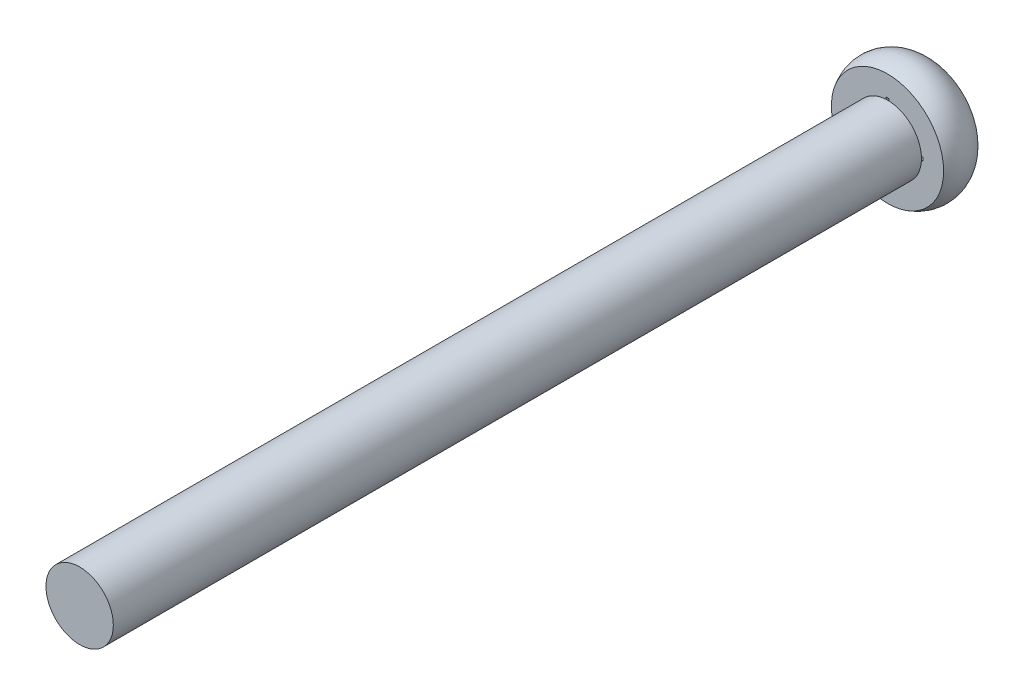
ISO-10303-21;
HEADER;
FILE_DESCRIPTION(('STEP AP214'),'2;1');
FILE_NAME('part.step','',(''),(''),'','','');
FILE_SCHEMA(('AUTOMOTIVE_DESIGN { 1 0 10303 214 1 1 1 1 }'));
ENDSEC;
DATA;
#1=APPLICATION_CONTEXT('core data for automotive mechanical design processes');
#2=APPLICATION_PROTOCOL_DEFINITION('international standard','automotive_design',2000,#1);
#3=PRODUCT_CONTEXT('',#1,'mechanical');
#4=PRODUCT('Part','Part','',(#3));
#5=PRODUCT_RELATED_PRODUCT_CATEGORY('part','',(#4));
#6=PRODUCT_DEFINITION_FORMATION('','',#4);
#7=PRODUCT_DEFINITION_CONTEXT('part definition',#1,'design');
#8=PRODUCT_DEFINITION('design','',#6,#7);
#9=PRODUCT_DEFINITION_SHAPE('','',#8);
#10=(LENGTH_UNIT() NAMED_UNIT(*) SI_UNIT(.MILLI.,.METRE.));
#11=(NAMED_UNIT(*) PLANE_ANGLE_UNIT() SI_UNIT($,.RADIAN.));
#12=(NAMED_UNIT(*) SI_UNIT($,.STERADIAN.) SOLID_ANGLE_UNIT());
#13=UNCERTAINTY_MEASURE_WITH_UNIT(LENGTH_MEASURE(1.E-05),#10,'distance_accuracy_value','');
#14=(GEOMETRIC_REPRESENTATION_CONTEXT(3) GLOBAL_UNCERTAINTY_ASSIGNED_CONTEXT((#13)) GLOBAL_UNIT_ASSIGNED_CONTEXT((#10,
#11,#12)) REPRESENTATION_CONTEXT('',''));
#15=CARTESIAN_POINT('',(0.,0.,0.));
#16=DIRECTION('',(0.,0.,1.));
#17=DIRECTION('',(1.,0.,0.));
#18=AXIS2_PLACEMENT_3D('',#15,#16,#17);
#19=CARTESIAN_POINT('',(0.,0.,-2.));
#20=DIRECTION('',(0.,0.,-1.));
#21=DIRECTION('',(-1.,0.,0.));
#22=AXIS2_PLACEMENT_3D('',#19,#20,#21);
#23=PLANE('',#22);
#24=DIRECTION('',(0.,-1.,0.));
#25=VECTOR('',#24,1.);
#26=CARTESIAN_POINT('',(0.5,-0.5,-2.));
#27=LINE('',#26,#25);
#28=CARTESIAN_POINT('',(0.5,-0.5,-2.));
#29=VERTEX_POINT('',#28);
#30=CARTESIAN_POINT('',(0.5,-1.72737700560521,-2.));
#31=VERTEX_POINT('',#30);
#32=EDGE_CURVE('E297',#29,#31,#27,.T.);
#33=ORIENTED_EDGE('',*,*,#32,.F.);
#34=DIRECTION('',(-1.,0.,0.));
#35=VECTOR('',#34,1.);
#36=CARTESIAN_POINT('',(2.,-0.5,-2.));
#37=LINE('',#36,#35);
#38=CARTESIAN_POINT('',(1.72737700560521,-0.5,-2.));
#39=VERTEX_POINT('',#38);
#40=EDGE_CURVE('E295',#39,#29,#37,.T.);
#41=ORIENTED_EDGE('',*,*,#40,.F.);
#42=CARTESIAN_POINT('',(0.,0.,-2.));
#43=DIRECTION('',(0.,0.,1.));
#44=DIRECTION('',(1.,0.,0.));
#45=AXIS2_PLACEMENT_3D('',#42,#43,#44);
#46=CIRCLE('',#45,1.79828566126008);
#47=EDGE_CURVE('E365',#31,#39,#46,.T.);
#48=ORIENTED_EDGE('',*,*,#47,.F.);
#49=EDGE_LOOP('',(#33,#41,#48));
#50=FACE_BOUND('',#49,.T.);
#51=ADVANCED_FACE('F35',(#50),#23,.T.);
#52=DIRECTION('',(1.,0.,0.));
#53=VECTOR('',#52,1.);
#54=CARTESIAN_POINT('',(2.,0.5,-2.));
#55=LINE('',#54,#53);
#56=CARTESIAN_POINT('',(0.5,0.5,-2.));
#57=VERTEX_POINT('',#56);
#58=CARTESIAN_POINT('',(1.72737700560521,0.5,-2.));
#59=VERTEX_POINT('',#58);
#60=EDGE_CURVE('E288',#57,#59,#55,.T.);
#61=ORIENTED_EDGE('',*,*,#60,.F.);
#62=DIRECTION('',(0.,-1.,0.));
#63=VECTOR('',#62,1.);
#64=CARTESIAN_POINT('',(0.5,2.,-2.));
#65=LINE('',#64,#63);
#66=CARTESIAN_POINT('',(0.5,1.72737700560521,-2.));
#67=VERTEX_POINT('',#66);
#68=EDGE_CURVE('E286',#67,#57,#65,.T.);
#69=ORIENTED_EDGE('',*,*,#68,.F.);
#70=EDGE_CURVE('E366',#59,#67,#46,.T.);
#71=ORIENTED_EDGE('',*,*,#70,.F.);
#72=EDGE_LOOP('',(#61,#69,#71));
#73=FACE_BOUND('',#72,.T.);
#74=ADVANCED_FACE('F259',(#73),#23,.T.);
#75=DIRECTION('',(0.,1.,0.));
#76=VECTOR('',#75,1.);
#77=CARTESIAN_POINT('',(-0.5,2.,-2.));
#78=LINE('',#77,#76);
#79=CARTESIAN_POINT('',(-0.5,0.5,-2.));
#80=VERTEX_POINT('',#79);
#81=CARTESIAN_POINT('',(-0.5,1.72737700560521,-2.));
#82=VERTEX_POINT('',#81);
#83=EDGE_CURVE('E279',#80,#82,#78,.T.);
#84=ORIENTED_EDGE('',*,*,#83,.F.);
#85=DIRECTION('',(1.,0.,0.));
#86=VECTOR('',#85,1.);
#87=CARTESIAN_POINT('',(-0.5,0.5,-2.));
#88=LINE('',#87,#86);
#89=CARTESIAN_POINT('',(-1.7273770056052,0.5,-2.));
#90=VERTEX_POINT('',#89);
#91=EDGE_CURVE('E280',#90,#80,#88,.T.);
#92=ORIENTED_EDGE('',*,*,#91,.F.);
#93=EDGE_CURVE('E282',#82,#90,#46,.T.);
#94=ORIENTED_EDGE('',*,*,#93,.F.);
#95=EDGE_LOOP('',(#84,#92,#94));
#96=FACE_BOUND('',#95,.T.);
#97=ADVANCED_FACE('F264',(#96),#23,.T.);
#98=CARTESIAN_POINT('',(0.,0.,0.));
#99=DIRECTION('',(0.,0.,1.));
#100=DIRECTION('',(1.,0.,0.));
#101=AXIS2_PLACEMENT_3D('',#98,#99,#100);
#102=PLANE('',#101);
#103=CARTESIAN_POINT('',(0.0135896024399493,-0.0135896024399496,0.));
#104=DIRECTION('',(0.,0.,1.));
#105=DIRECTION('',(1.,0.,0.));
#106=AXIS2_PLACEMENT_3D('',#103,#104,#105);
#107=CIRCLE('',#106,1.5);
#108=CARTESIAN_POINT('',(1.51097796644111,0.074886876659955,0.));
#109=VERTEX_POINT('',#108);
#110=CARTESIAN_POINT('',(0.0748868766599548,1.48515742230212,0.));
#111=VERTEX_POINT('',#110);
#112=EDGE_CURVE('E65',#109,#111,#107,.T.);
#113=ORIENTED_EDGE('',*,*,#112,.F.);
#114=DIRECTION('',(1.,0.,0.));
#115=VECTOR('',#114,1.);
#116=CARTESIAN_POINT('',(0.,0.074886876659955,0.));
#117=LINE('',#116,#115);
#118=CARTESIAN_POINT('',(1.57488687665996,0.0748868766599549,0.));
#119=VERTEX_POINT('',#118);
#120=EDGE_CURVE('E185',#109,#119,#117,.T.);
#121=ORIENTED_EDGE('',*,*,#120,.T.);
#122=DIRECTION('',(0.,-1.,0.));
#123=VECTOR('',#122,1.);
#124=CARTESIAN_POINT('',(1.57488687665995,0.,0.));
#125=LINE('',#124,#123);
#126=CARTESIAN_POINT('',(1.57488687665996,-0.074886876659955,0.));
#127=VERTEX_POINT('',#126);
#128=EDGE_CURVE('E344',#119,#127,#125,.T.);
#129=ORIENTED_EDGE('',*,*,#128,.T.);
#130=DIRECTION('',(-1.,0.,0.));
#131=VECTOR('',#130,1.);
#132=CARTESIAN_POINT('',(0.,-0.0748868766599549,0.));
#133=LINE('',#132,#131);
#134=CARTESIAN_POINT('',(1.51233662718202,-0.0748868766599549,0.));
#135=VERTEX_POINT('',#134);
#136=EDGE_CURVE('E341',#127,#135,#133,.T.);
#137=ORIENTED_EDGE('',*,*,#136,.T.);
#138=CARTESIAN_POINT('',(0.0748868766599548,-1.51233662718202,0.));
#139=VERTEX_POINT('',#138);
#140=EDGE_CURVE('E58',#139,#135,#107,.T.);
#141=ORIENTED_EDGE('',*,*,#140,.F.);
#142=DIRECTION('',(0.,-1.,0.));
#143=VECTOR('',#142,1.);
#144=CARTESIAN_POINT('',(0.0748868766599551,0.,0.));
#145=LINE('',#144,#143);
#146=CARTESIAN_POINT('',(0.0748868766599548,-1.57488687665996,0.));
#147=VERTEX_POINT('',#146);
#148=EDGE_CURVE('E340',#139,#147,#145,.T.);
#149=ORIENTED_EDGE('',*,*,#148,.T.);
#150=DIRECTION('',(-1.,0.,0.));
#151=VECTOR('',#150,1.);
#152=CARTESIAN_POINT('',(0.,-1.57488687665995,0.));
#153=LINE('',#152,#151);
#154=CARTESIAN_POINT('',(-0.0748868766599552,-1.57488687665996,0.));
#155=VERTEX_POINT('',#154);
#156=EDGE_CURVE('E308',#147,#155,#153,.T.);
#157=ORIENTED_EDGE('',*,*,#156,.T.);
#158=DIRECTION('',(0.,1.,0.));
#159=VECTOR('',#158,1.);
#160=CARTESIAN_POINT('',(-0.0748868766599548,0.,0.));
#161=LINE('',#160,#159);
#162=CARTESIAN_POINT('',(-0.074886876659955,-1.51097796644111,0.));
#163=VERTEX_POINT('',#162);
#164=EDGE_CURVE('E332',#155,#163,#161,.T.);
#165=ORIENTED_EDGE('',*,*,#164,.T.);
#166=CARTESIAN_POINT('',(-1.48515742230212,-0.0748868766599549,0.));
#167=VERTEX_POINT('',#166);
#168=EDGE_CURVE('E49',#167,#163,#107,.T.);
#169=ORIENTED_EDGE('',*,*,#168,.F.);
#170=DIRECTION('',(-1.,0.,0.));
#171=VECTOR('',#170,1.);
#172=CARTESIAN_POINT('',(0.,-0.0748868766599549,0.));
#173=LINE('',#172,#171);
#174=CARTESIAN_POINT('',(-1.57488687665995,-0.0748868766599549,0.));
#175=VERTEX_POINT('',#174);
#176=EDGE_CURVE('E334',#167,#175,#173,.T.);
#177=ORIENTED_EDGE('',*,*,#176,.T.);
#178=DIRECTION('',(0.,1.,0.));
#179=VECTOR('',#178,1.);
#180=CARTESIAN_POINT('',(-1.57488687665995,0.,0.));
#181=LINE('',#180,#179);
#182=CARTESIAN_POINT('',(-1.57488687665996,0.074886876659955,0.));
#183=VERTEX_POINT('',#182);
#184=EDGE_CURVE('E355',#175,#183,#181,.T.);
#185=ORIENTED_EDGE('',*,*,#184,.T.);
#186=DIRECTION('',(1.,0.,0.));
#187=VECTOR('',#186,1.);
#188=CARTESIAN_POINT('',(0.,0.0748868766599549,0.));
#189=LINE('',#188,#187);
#190=CARTESIAN_POINT('',(-1.48379876156122,0.0748868766599549,0.));
#191=VERTEX_POINT('',#190);
#192=EDGE_CURVE('E352',#183,#191,#189,.T.);
#193=ORIENTED_EDGE('',*,*,#192,.T.);
#194=CARTESIAN_POINT('',(-0.0748868766599547,1.48379876156122,0.));
#195=VERTEX_POINT('',#194);
#196=EDGE_CURVE('E11',#195,#191,#107,.T.);
#197=ORIENTED_EDGE('',*,*,#196,.F.);
#198=DIRECTION('',(0.,1.,0.));
#199=VECTOR('',#198,1.);
#200=CARTESIAN_POINT('',(-0.0748868766599548,0.,0.));
#201=LINE('',#200,#199);
#202=CARTESIAN_POINT('',(-0.0748868766599548,1.57488687665996,0.));
#203=VERTEX_POINT('',#202);
#204=EDGE_CURVE('E351',#195,#203,#201,.T.);
#205=ORIENTED_EDGE('',*,*,#204,.T.);
#206=DIRECTION('',(1.,0.,0.));
#207=VECTOR('',#206,1.);
#208=CARTESIAN_POINT('',(0.,1.57488687665995,0.));
#209=LINE('',#208,#207);
#210=CARTESIAN_POINT('',(0.0748868766599549,1.57488687665996,0.));
#211=VERTEX_POINT('',#210);
#212=EDGE_CURVE('E182',#203,#211,#209,.T.);
#213=ORIENTED_EDGE('',*,*,#212,.T.);
#214=DIRECTION('',(0.,-1.,0.));
#215=VECTOR('',#214,1.);
#216=CARTESIAN_POINT('',(0.0748868766599546,0.,0.));
#217=LINE('',#216,#215);
#218=EDGE_CURVE('E178',#211,#111,#217,.T.);
#219=ORIENTED_EDGE('',*,*,#218,.T.);
#220=EDGE_LOOP('',(#113,#121,#129,#137,#141,#149,#157,#165,#169,#177,#185,#193,#197,#205,#213,#219));
#221=FACE_BOUND('',#220,.T.);
#222=CARTESIAN_POINT('',(0.,0.,0.));
#223=DIRECTION('',(0.,0.,1.));
#224=DIRECTION('',(1.,0.,0.));
#225=AXIS2_PLACEMENT_3D('',#222,#223,#224);
#226=CIRCLE('',#225,2.5);
#227=CARTESIAN_POINT('',(2.5,0.,0.));
#228=VERTEX_POINT('',#227);
#229=EDGE_CURVE('E302',#228,#228,#226,.T.);
#230=ORIENTED_EDGE('',*,*,#229,.T.);
#231=EDGE_LOOP('',(#230));
#232=FACE_BOUND('',#231,.T.);
#233=ADVANCED_FACE('F37',(#221,#232),#102,.T.);
#234=DIRECTION('',(0.,1.,0.));
#235=VECTOR('',#234,1.);
#236=CARTESIAN_POINT('',(-0.5,-0.5,-2.));
#237=LINE('',#236,#235);
#238=CARTESIAN_POINT('',(-0.5,-1.72737700560521,-2.));
#239=VERTEX_POINT('',#238);
#240=CARTESIAN_POINT('',(-0.5,-0.5,-2.));
#241=VERTEX_POINT('',#240);
#242=EDGE_CURVE('E211',#239,#241,#237,.T.);
#243=ORIENTED_EDGE('',*,*,#242,.F.);
#244=CARTESIAN_POINT('',(-1.7273770056052,-0.5,-2.));
#245=VERTEX_POINT('',#244);
#246=EDGE_CURVE('E465',#245,#239,#46,.T.);
#247=ORIENTED_EDGE('',*,*,#246,.F.);
#248=DIRECTION('',(-1.,0.,0.));
#249=VECTOR('',#248,1.);
#250=CARTESIAN_POINT('',(-0.5,-0.5,-2.));
#251=LINE('',#250,#249);
#252=EDGE_CURVE('E290',#241,#245,#251,.T.);
#253=ORIENTED_EDGE('',*,*,#252,.F.);
#254=EDGE_LOOP('',(#243,#247,#253));
#255=FACE_BOUND('',#254,.T.);
#256=ADVANCED_FACE('F254',(#255),#23,.T.);
#257=CARTESIAN_POINT('',(0.,0.,-1.5));
#258=DIRECTION('',(0.,0.,1.));
#259=DIRECTION('',(1.,0.,0.));
#260=AXIS2_PLACEMENT_3D('',#257,#258,#259);
#261=TOROIDAL_SURFACE('',#260,1.79828566126008,0.5);
#262=CARTESIAN_POINT('',(-0.484531485230559,-2.00019999999807,-1.92722635966677));
#263=CARTESIAN_POINT('',(-0.487730741656916,-1.97399509292181,-1.94227767777816));
#264=CARTESIAN_POINT('',(-0.490465318957066,-1.94648320162751,-1.95514285248114));
#265=CARTESIAN_POINT('',(-0.494944021195538,-1.88965509794122,-1.97621348988364));
#266=CARTESIAN_POINT('',(-0.49668820162521,-1.86033898674063,-1.98441921364944));
#267=CARTESIAN_POINT('',(-0.499126116457835,-1.80069115496455,-1.99588870117535));
#268=CARTESIAN_POINT('',(-0.499819222481771,-1.7703588379215,-1.99914950864462));
#269=CARTESIAN_POINT('',(-0.500118732977777,-1.70955778735153,-2.00055859474223));
#270=CARTESIAN_POINT('',(-0.499724916277443,-1.67908902731998,-1.99870583283623));
#271=CARTESIAN_POINT('',(-0.497853789650744,-1.61942291189497,-1.98990287416961));
#272=CARTESIAN_POINT('',(-0.496393740016551,-1.59021306252827,-1.98303388069926));
#273=CARTESIAN_POINT('',(-0.492425751368406,-1.53353662294232,-1.96436596183112));
#274=CARTESIAN_POINT('',(-0.489920279158611,-1.50606610316026,-1.95257864183446));
#275=CARTESIAN_POINT('',(-0.485522319982868,-1.46775366051375,-1.931887870676));
#276=CARTESIAN_POINT('',(-0.48401623101767,-1.45586102614728,-1.92480227918278));
#277=CARTESIAN_POINT('',(-0.482405797596021,-1.44431196382551,-1.91722578561798));
#278=B_SPLINE_CURVE_WITH_KNOTS('',3,(#262,#263,#264,#265,#266,#267,#268,#269,#270,#271,#272,
#273,#274,#275,#276,#277),.UNSPECIFIED.,.F.,.F.,(4,2,2,2,2,2,2,4),(0.,0.0910547846834963,
0.182104467117809,0.273208561671024,0.364331195901967,0.454010535018956,0.54347945069811,
0.58520313275069),.UNSPECIFIED.);
#279=CARTESIAN_POINT('',(-0.486182621994021,-1.98618262199402,-1.93499434739903));
#280=VERTEX_POINT('',#279);
#281=EDGE_CURVE('E39',#280,#239,#278,.T.);
#282=ORIENTED_EDGE('',*,*,#281,.F.);
#283=CARTESIAN_POINT('',(0.5002,-1.98581559026671,-1.93326759888358));
#284=CARTESIAN_POINT('',(0.458674648231671,-1.98692132952452,-1.9384696930891));
#285=CARTESIAN_POINT('',(0.417044034812075,-1.98783464761585,-1.94276651688112));
#286=CARTESIAN_POINT('',(0.333664845511619,-1.9893386810461,-1.94984243784272));
#287=CARTESIAN_POINT('',(0.29191632987224,-1.98992953873244,-1.95262220470428));
#288=CARTESIAN_POINT('',(0.208490270761662,-1.99085028730934,-1.95695398618246));
#289=CARTESIAN_POINT('',(0.166812925350122,-1.99118100417595,-1.9585098867108));
#290=CARTESIAN_POINT('',(0.0834237232848287,-1.99161800350579,-1.96056580691581));
#291=CARTESIAN_POINT('',(0.0417118616424145,-1.99172424407747,-1.96106562950817));
#292=CARTESIAN_POINT('',(-0.041711861642414,-1.99172424407747,-1.96106562950817));
#293=CARTESIAN_POINT('',(-0.0834237232848281,-1.99161800350579,-1.96056580691581));
#294=CARTESIAN_POINT('',(-0.166812925350122,-1.99118100417595,-1.9585098867108));
#295=CARTESIAN_POINT('',(-0.208490270761662,-1.99085028730934,-1.95695398618246));
#296=CARTESIAN_POINT('',(-0.291916329872239,-1.98992953873244,-1.95262220470428));
#297=CARTESIAN_POINT('',(-0.333664845511618,-1.9893386810461,-1.94984243784272));
#298=CARTESIAN_POINT('',(-0.417044034812074,-1.98783464761585,-1.94276651688112));
#299=CARTESIAN_POINT('',(-0.45867464823167,-1.98692132952452,-1.9384696930891));
#300=CARTESIAN_POINT('',(-0.5002,-1.98581559026671,-1.93326759888359));
#301=B_SPLINE_CURVE_WITH_KNOTS('',3,(#283,#284,#285,#286,#287,#288,#289,#290,#291,#292,#293,
#294,#295,#296,#297,#298,#299,#300),.UNSPECIFIED.,.F.,.F.,(4,2,2,2,2,2,2,2,4),(0.,
0.125564223486189,0.251072972778261,0.376181590916074,0.501313554648638,0.626445518381203,
0.751554136519016,0.877062885811087,1.00262710929728),.UNSPECIFIED.);
#302=CARTESIAN_POINT('',(0.486182621995521,-1.98618262199552,-1.93499434740608));
#303=VERTEX_POINT('',#302);
#304=EDGE_CURVE('E217',#303,#280,#301,.T.);
#305=ORIENTED_EDGE('',*,*,#304,.F.);
#306=CARTESIAN_POINT('',(0.482405797596021,-1.44431196382551,-1.91722578561798));
#307=CARTESIAN_POINT('',(0.48570203714361,-1.46793057965583,-1.93273337344162));
#308=CARTESIAN_POINT('',(0.488553243755359,-1.49294141348437,-1.9461472459156));
#309=CARTESIAN_POINT('',(0.493325435218341,-1.54485980961068,-1.96859864156054));
#310=CARTESIAN_POINT('',(0.495248995147375,-1.5717618809991,-1.97764827952006));
#311=CARTESIAN_POINT('',(0.498143025152659,-1.62668784813388,-1.99126362022065));
#312=CARTESIAN_POINT('',(0.499114471003381,-1.65471056465713,-1.99583391361969));
#313=CARTESIAN_POINT('',(0.500106949655182,-1.71116057422037,-2.00050315856797));
#314=CARTESIAN_POINT('',(0.500127192003302,-1.73958818410787,-2.00059839132842));
#315=CARTESIAN_POINT('',(0.499213639216544,-1.79721040961986,-1.99630046338124));
#316=CARTESIAN_POINT('',(0.498242311098956,-1.8263912500544,-1.99173072387306));
#317=CARTESIAN_POINT('',(0.49532622888695,-1.88357006660964,-1.97801163569674));
#318=CARTESIAN_POINT('',(0.493382581774675,-1.91156934871115,-1.96886749497013));
#319=CARTESIAN_POINT('',(0.489106524735073,-1.95978622862111,-1.94875022827176));
#320=CARTESIAN_POINT('',(0.486951064586047,-1.98037020541711,-1.93860958555488));
#321=CARTESIAN_POINT('',(0.484531485230559,-2.00019999999807,-1.92722635966678));
#322=B_SPLINE_CURVE_WITH_KNOTS('',3,(#306,#307,#308,#309,#310,#311,#312,#313,#314,#315,#316,
#317,#318,#319,#320,#321),.UNSPECIFIED.,.F.,.F.,(4,2,2,2,2,2,2,4),(0.,0.0851751988614574,
0.170112576964328,0.254962815655872,0.339883563903854,0.428142412513317,0.516301006602909,
0.585253181874986),.UNSPECIFIED.);
#323=EDGE_CURVE('E222',#31,#303,#322,.T.);
#324=ORIENTED_EDGE('',*,*,#323,.F.);
#325=ORIENTED_EDGE('',*,*,#47,.T.);
#326=CARTESIAN_POINT('',(2.00019999999807,-0.484531485230559,-1.92722635966678));
#327=CARTESIAN_POINT('',(1.97399509292181,-0.487730741656916,-1.94227767777816));
#328=CARTESIAN_POINT('',(1.94648320162751,-0.490465318957066,-1.95514285248114));
#329=CARTESIAN_POINT('',(1.88965509794122,-0.494944021195538,-1.97621348988364));
#330=CARTESIAN_POINT('',(1.86033898674063,-0.49668820162521,-1.98441921364944));
#331=CARTESIAN_POINT('',(1.80069115496455,-0.499126116457835,-1.99588870117535));
#332=CARTESIAN_POINT('',(1.7703588379215,-0.499819222481771,-1.99914950864462));
#333=CARTESIAN_POINT('',(1.70955778735153,-0.500118732977777,-2.00055859474224));
#334=CARTESIAN_POINT('',(1.67908902731998,-0.499724916277443,-1.99870583283623));
#335=CARTESIAN_POINT('',(1.61942291189497,-0.497853789650743,-1.98990287416961));
#336=CARTESIAN_POINT('',(1.59021306252827,-0.49639374001655,-1.98303388069925));
#337=CARTESIAN_POINT('',(1.53353662294232,-0.492425751368405,-1.96436596183112));
#338=CARTESIAN_POINT('',(1.50606610316026,-0.48992027915861,-1.95257864183446));
#339=CARTESIAN_POINT('',(1.46775366051375,-0.485522319982867,-1.931887870676));
#340=CARTESIAN_POINT('',(1.45586102614728,-0.484016231017669,-1.92480227918278));
#341=CARTESIAN_POINT('',(1.44431196382552,-0.482405797596021,-1.91722578561798));
#342=B_SPLINE_CURVE_WITH_KNOTS('',3,(#326,#327,#328,#329,#330,#331,#332,#333,#334,#335,#336,
#337,#338,#339,#340,#341),.UNSPECIFIED.,.F.,.F.,(4,2,2,2,2,2,2,4),(0.,0.0910547846834966,
0.182104467117809,0.273208561671024,0.364331195901968,0.454010535018956,0.543479450698109,
0.585203132750685),.UNSPECIFIED.);
#343=CARTESIAN_POINT('',(1.98618262199402,-0.486182621994021,-1.93499434739903));
#344=VERTEX_POINT('',#343);
#345=EDGE_CURVE('E226',#344,#39,#342,.T.);
#346=ORIENTED_EDGE('',*,*,#345,.F.);
#347=CARTESIAN_POINT('',(1.98581559026671,0.5002,-1.93326759888358));
#348=CARTESIAN_POINT('',(1.98692132952452,0.458674648231671,-1.9384696930891));
#349=CARTESIAN_POINT('',(1.98783464761585,0.417044034812075,-1.94276651688112));
#350=CARTESIAN_POINT('',(1.9893386810461,0.333664845511619,-1.94984243784273));
#351=CARTESIAN_POINT('',(1.98992953873244,0.29191632987224,-1.95262220470428));
#352=CARTESIAN_POINT('',(1.99085028730934,0.208490270761663,-1.95695398618246));
#353=CARTESIAN_POINT('',(1.99118100417595,0.166812925350123,-1.95850988671081));
#354=CARTESIAN_POINT('',(1.99161800350579,0.0834237232848289,-1.96056580691581));
#355=CARTESIAN_POINT('',(1.99172424407747,0.0417118616424147,-1.96106562950817));
#356=CARTESIAN_POINT('',(1.99172424407747,-0.0417118616424138,-1.96106562950817));
#357=CARTESIAN_POINT('',(1.99161800350579,-0.083423723284828,-1.96056580691581));
#358=CARTESIAN_POINT('',(1.99118100417595,-0.166812925350122,-1.95850988671081));
#359=CARTESIAN_POINT('',(1.99085028730934,-0.208490270761661,-1.95695398618246));
#360=CARTESIAN_POINT('',(1.98992953873244,-0.291916329872239,-1.95262220470428));
#361=CARTESIAN_POINT('',(1.9893386810461,-0.333664845511618,-1.94984243784272));
#362=CARTESIAN_POINT('',(1.98783464761585,-0.417044034812074,-1.94276651688112));
#363=CARTESIAN_POINT('',(1.98692132952452,-0.45867464823167,-1.93846969308911));
#364=CARTESIAN_POINT('',(1.98581559026671,-0.500199999999999,-1.93326759888359));
#365=B_SPLINE_CURVE_WITH_KNOTS('',3,(#347,#348,#349,#350,#351,#352,#353,#354,#355,#356,#357,
#358,#359,#360,#361,#362,#363,#364),.UNSPECIFIED.,.F.,.F.,(4,2,2,2,2,2,2,2,4),(0.,
0.125564223486189,0.251072972778261,0.376181590916074,0.501313554648638,0.626445518381203,
0.751554136519016,0.877062885811087,1.00262710929728),.UNSPECIFIED.);
#366=CARTESIAN_POINT('',(1.98618262199552,0.486182621995521,-1.93499434740608));
#367=VERTEX_POINT('',#366);
#368=EDGE_CURVE('E440',#367,#344,#365,.T.);
#369=ORIENTED_EDGE('',*,*,#368,.F.);
#370=CARTESIAN_POINT('',(1.44431196382552,0.482405797596021,-1.91722578561798));
#371=CARTESIAN_POINT('',(1.46793057965583,0.48570203714361,-1.93273337344162));
#372=CARTESIAN_POINT('',(1.49294141348437,0.488553243755359,-1.9461472459156));
#373=CARTESIAN_POINT('',(1.54485980961068,0.493325435218341,-1.96859864156054));
#374=CARTESIAN_POINT('',(1.5717618809991,0.495248995147375,-1.97764827952006));
#375=CARTESIAN_POINT('',(1.62668784813388,0.498143025152659,-1.99126362022065));
#376=CARTESIAN_POINT('',(1.65471056465713,0.499114471003381,-1.99583391361969));
#377=CARTESIAN_POINT('',(1.71116057422037,0.500106949655182,-2.00050315856797));
#378=CARTESIAN_POINT('',(1.73958818410787,0.500127192003302,-2.00059839132842));
#379=CARTESIAN_POINT('',(1.79721040961986,0.499213639216544,-1.99630046338124));
#380=CARTESIAN_POINT('',(1.8263912500544,0.498242311098957,-1.99173072387306));
#381=CARTESIAN_POINT('',(1.88357006660964,0.495326228886951,-1.97801163569674));
#382=CARTESIAN_POINT('',(1.91156934871115,0.493382581774675,-1.96886749497012));
#383=CARTESIAN_POINT('',(1.95978622862112,0.489106524735073,-1.94875022827176));
#384=CARTESIAN_POINT('',(1.98037020541711,0.486951064586048,-1.93860958555488));
#385=CARTESIAN_POINT('',(2.00019999999807,0.484531485230559,-1.92722635966678));
#386=B_SPLINE_CURVE_WITH_KNOTS('',3,(#370,#371,#372,#373,#374,#375,#376,#377,#378,#379,#380,
#381,#382,#383,#384,#385),.UNSPECIFIED.,.F.,.F.,(4,2,2,2,2,2,2,4),(0.,0.0851751988614576,
0.170112576964329,0.254962815655873,0.339883563903855,0.428142412513318,0.516301006602911,
0.585253181874984),.UNSPECIFIED.);
#387=EDGE_CURVE('E435',#59,#367,#386,.T.);
#388=ORIENTED_EDGE('',*,*,#387,.F.);
#389=ORIENTED_EDGE('',*,*,#70,.T.);
#390=CARTESIAN_POINT('',(0.484531485230559,2.00019999999807,-1.92722635966678));
#391=CARTESIAN_POINT('',(0.487730741656916,1.97399509292181,-1.94227767777816));
#392=CARTESIAN_POINT('',(0.490465318957066,1.94648320162751,-1.95514285248114));
#393=CARTESIAN_POINT('',(0.494944021195538,1.88965509794122,-1.97621348988364));
#394=CARTESIAN_POINT('',(0.49668820162521,1.86033898674063,-1.98441921364944));
#395=CARTESIAN_POINT('',(0.499126116457835,1.80069115496455,-1.99588870117535));
#396=CARTESIAN_POINT('',(0.499819222481771,1.7703588379215,-1.99914950864462));
#397=CARTESIAN_POINT('',(0.500118732977777,1.70955778735153,-2.00055859474224));
#398=CARTESIAN_POINT('',(0.499724916277443,1.67908902731998,-1.99870583283623));
#399=CARTESIAN_POINT('',(0.497853789650743,1.61942291189497,-1.98990287416961));
#400=CARTESIAN_POINT('',(0.49639374001655,1.59021306252827,-1.98303388069925));
#401=CARTESIAN_POINT('',(0.492425751368405,1.53353662294232,-1.96436596183112));
#402=CARTESIAN_POINT('',(0.48992027915861,1.50606610316026,-1.95257864183446));
#403=CARTESIAN_POINT('',(0.485522319982867,1.46775366051375,-1.931887870676));
#404=CARTESIAN_POINT('',(0.484016231017669,1.45586102614728,-1.92480227918278));
#405=CARTESIAN_POINT('',(0.482405797596021,1.44431196382551,-1.91722578561798));
#406=B_SPLINE_CURVE_WITH_KNOTS('',3,(#390,#391,#392,#393,#394,#395,#396,#397,#398,#399,#400,
#401,#402,#403,#404,#405),.UNSPECIFIED.,.F.,.F.,(4,2,2,2,2,2,2,4),(0.,0.0910547846834967,
0.18210446711781,0.273208561671024,0.364331195901968,0.454010535018957,0.54347945069811,
0.585203132750688),.UNSPECIFIED.);
#407=CARTESIAN_POINT('',(0.486182621994021,1.98618262199402,-1.93499434739903));
#408=VERTEX_POINT('',#407);
#409=EDGE_CURVE('E415',#408,#67,#406,.T.);
#410=ORIENTED_EDGE('',*,*,#409,.F.);
#411=CARTESIAN_POINT('',(-0.5002,1.98581559026671,-1.93326759888358));
#412=CARTESIAN_POINT('',(-0.458674648231671,1.98692132952452,-1.9384696930891));
#413=CARTESIAN_POINT('',(-0.417044034812075,1.98783464761585,-1.94276651688112));
#414=CARTESIAN_POINT('',(-0.333664845511619,1.9893386810461,-1.94984243784272));
#415=CARTESIAN_POINT('',(-0.29191632987224,1.98992953873244,-1.95262220470428));
#416=CARTESIAN_POINT('',(-0.208490270761662,1.99085028730934,-1.95695398618246));
#417=CARTESIAN_POINT('',(-0.166812925350122,1.99118100417595,-1.9585098867108));
#418=CARTESIAN_POINT('',(-0.0834237232848289,1.99161800350579,-1.96056580691581));
#419=CARTESIAN_POINT('',(-0.0417118616424146,1.99172424407747,-1.96106562950817));
#420=CARTESIAN_POINT('',(0.0417118616424138,1.99172424407747,-1.96106562950817));
#421=CARTESIAN_POINT('',(0.0834237232848279,1.99161800350579,-1.96056580691581));
#422=CARTESIAN_POINT('',(0.166812925350122,1.99118100417595,-1.9585098867108));
#423=CARTESIAN_POINT('',(0.208490270761661,1.99085028730934,-1.95695398618246));
#424=CARTESIAN_POINT('',(0.291916329872239,1.98992953873244,-1.95262220470428));
#425=CARTESIAN_POINT('',(0.333664845511618,1.9893386810461,-1.94984243784272));
#426=CARTESIAN_POINT('',(0.417044034812074,1.98783464761585,-1.94276651688112));
#427=CARTESIAN_POINT('',(0.45867464823167,1.98692132952452,-1.93846969308911));
#428=CARTESIAN_POINT('',(0.500199999999999,1.98581559026671,-1.93326759888359));
#429=B_SPLINE_CURVE_WITH_KNOTS('',3,(#411,#412,#413,#414,#415,#416,#417,#418,#419,#420,#421,
#422,#423,#424,#425,#426,#427,#428),.UNSPECIFIED.,.F.,.F.,(4,2,2,2,2,2,2,2,4),(0.,
0.125564223486189,0.251072972778261,0.376181590916074,0.501313554648638,0.626445518381203,
0.751554136519016,0.877062885811087,1.00262710929728),.UNSPECIFIED.);
#430=CARTESIAN_POINT('',(-0.486182621995521,1.98618262199552,-1.93499434740608));
#431=VERTEX_POINT('',#430);
#432=EDGE_CURVE('E410',#431,#408,#429,.T.);
#433=ORIENTED_EDGE('',*,*,#432,.F.);
#434=CARTESIAN_POINT('',(-0.482405797596021,1.44431196382551,-1.91722578561798));
#435=CARTESIAN_POINT('',(-0.485702037143609,1.46793057965583,-1.93273337344162));
#436=CARTESIAN_POINT('',(-0.488553243755359,1.49294141348437,-1.9461472459156));
#437=CARTESIAN_POINT('',(-0.493325435218341,1.54485980961068,-1.96859864156054));
#438=CARTESIAN_POINT('',(-0.495248995147375,1.5717618809991,-1.97764827952006));
#439=CARTESIAN_POINT('',(-0.498143025152659,1.62668784813388,-1.99126362022065));
#440=CARTESIAN_POINT('',(-0.499114471003381,1.65471056465713,-1.99583391361969));
#441=CARTESIAN_POINT('',(-0.500106949655181,1.71116057422037,-2.00050315856797));
#442=CARTESIAN_POINT('',(-0.500127192003302,1.73958818410786,-2.00059839132842));
#443=CARTESIAN_POINT('',(-0.499213639216544,1.79721040961986,-1.99630046338124));
#444=CARTESIAN_POINT('',(-0.498242311098956,1.8263912500544,-1.99173072387306));
#445=CARTESIAN_POINT('',(-0.49532622888695,1.88357006660964,-1.97801163569674));
#446=CARTESIAN_POINT('',(-0.493382581774675,1.91156934871115,-1.96886749497012));
#447=CARTESIAN_POINT('',(-0.489106524735072,1.95978622862111,-1.94875022827176));
#448=CARTESIAN_POINT('',(-0.486951064586047,1.98037020541711,-1.93860958555488));
#449=CARTESIAN_POINT('',(-0.484531485230559,2.00019999999807,-1.92722635966677));
#450=B_SPLINE_CURVE_WITH_KNOTS('',3,(#434,#435,#436,#437,#438,#439,#440,#441,#442,#443,#444,
#445,#446,#447,#448,#449),.UNSPECIFIED.,.F.,.F.,(4,2,2,2,2,2,2,4),(0.,0.0851751988614578,
0.170112576964329,0.254962815655873,0.339883563903855,0.428142412513318,0.51630100660291,
0.585253181874989),.UNSPECIFIED.);
#451=EDGE_CURVE('E405',#82,#431,#450,.T.);
#452=ORIENTED_EDGE('',*,*,#451,.F.);
#453=ORIENTED_EDGE('',*,*,#93,.T.);
#454=CARTESIAN_POINT('',(-2.00019999999807,0.484531485230558,-1.92722635966677));
#455=CARTESIAN_POINT('',(-1.97399509292181,0.487730741656916,-1.94227767777816));
#456=CARTESIAN_POINT('',(-1.94648320162751,0.490465318957066,-1.95514285248114));
#457=CARTESIAN_POINT('',(-1.88965509794122,0.494944021195537,-1.97621348988364));
#458=CARTESIAN_POINT('',(-1.86033898674063,0.49668820162521,-1.98441921364944));
#459=CARTESIAN_POINT('',(-1.80069115496455,0.499126116457835,-1.99588870117535));
#460=CARTESIAN_POINT('',(-1.7703588379215,0.499819222481771,-1.99914950864462));
#461=CARTESIAN_POINT('',(-1.70955778735153,0.500118732977777,-2.00055859474223));
#462=CARTESIAN_POINT('',(-1.67908902731998,0.499724916277443,-1.99870583283623));
#463=CARTESIAN_POINT('',(-1.61942291189497,0.497853789650744,-1.98990287416961));
#464=CARTESIAN_POINT('',(-1.59021306252827,0.49639374001655,-1.98303388069926));
#465=CARTESIAN_POINT('',(-1.53353662294232,0.492425751368405,-1.96436596183112));
#466=CARTESIAN_POINT('',(-1.50606610316026,0.489920279158611,-1.95257864183446));
#467=CARTESIAN_POINT('',(-1.46775366051375,0.485522319982867,-1.931887870676));
#468=CARTESIAN_POINT('',(-1.45586102614727,0.484016231017669,-1.92480227918278));
#469=CARTESIAN_POINT('',(-1.44431196382551,0.482405797596021,-1.91722578561798));
#470=B_SPLINE_CURVE_WITH_KNOTS('',3,(#454,#455,#456,#457,#458,#459,#460,#461,#462,#463,#464,
#465,#466,#467,#468,#469),.UNSPECIFIED.,.F.,.F.,(4,2,2,2,2,2,2,4),(0.,0.0910547846834969,
0.18210446711781,0.273208561671025,0.364331195901969,0.454010535018958,0.543479450698111,
0.585203132750693),.UNSPECIFIED.);
#471=CARTESIAN_POINT('',(-1.98618262199402,0.486182621994021,-1.93499434739903));
#472=VERTEX_POINT('',#471);
#473=EDGE_CURVE('E400',#472,#90,#470,.T.);
#474=ORIENTED_EDGE('',*,*,#473,.F.);
#475=CARTESIAN_POINT('',(-1.98581559026671,-0.5002,-1.93326759888358));
#476=CARTESIAN_POINT('',(-1.98692132952452,-0.458674648231671,-1.9384696930891));
#477=CARTESIAN_POINT('',(-1.98783464761585,-0.417044034812075,-1.94276651688112));
#478=CARTESIAN_POINT('',(-1.9893386810461,-0.333664845511619,-1.94984243784272));
#479=CARTESIAN_POINT('',(-1.98992953873244,-0.29191632987224,-1.95262220470428));
#480=CARTESIAN_POINT('',(-1.99085028730934,-0.208490270761662,-1.95695398618246));
#481=CARTESIAN_POINT('',(-1.99118100417595,-0.166812925350123,-1.9585098867108));
#482=CARTESIAN_POINT('',(-1.99161800350579,-0.0834237232848289,-1.96056580691581));
#483=CARTESIAN_POINT('',(-1.99172424407747,-0.0417118616424146,-1.96106562950817));
#484=CARTESIAN_POINT('',(-1.99172424407747,0.0417118616424138,-1.96106562950817));
#485=CARTESIAN_POINT('',(-1.99161800350579,0.083423723284828,-1.96056580691581));
#486=CARTESIAN_POINT('',(-1.99118100417595,0.166812925350122,-1.9585098867108));
#487=CARTESIAN_POINT('',(-1.99085028730934,0.208490270761661,-1.95695398618246));
#488=CARTESIAN_POINT('',(-1.98992953873244,0.291916329872239,-1.95262220470428));
#489=CARTESIAN_POINT('',(-1.9893386810461,0.333664845511618,-1.94984243784272));
#490=CARTESIAN_POINT('',(-1.98783464761585,0.417044034812074,-1.94276651688112));
#491=CARTESIAN_POINT('',(-1.98692132952452,0.45867464823167,-1.9384696930891));
#492=CARTESIAN_POINT('',(-1.98581559026671,0.500199999999999,-1.93326759888359));
#493=B_SPLINE_CURVE_WITH_KNOTS('',3,(#475,#476,#477,#478,#479,#480,#481,#482,#483,#484,#485,
#486,#487,#488,#489,#490,#491,#492),.UNSPECIFIED.,.F.,.F.,(4,2,2,2,2,2,2,2,4),(0.,
0.125564223486189,0.251072972778261,0.376181590916074,0.501313554648638,0.626445518381203,
0.751554136519016,0.877062885811088,1.00262710929728),.UNSPECIFIED.);
#494=CARTESIAN_POINT('',(-1.98618262199552,-0.486182621995521,-1.93499434740608));
#495=VERTEX_POINT('',#494);
#496=EDGE_CURVE('E375',#495,#472,#493,.T.);
#497=ORIENTED_EDGE('',*,*,#496,.F.);
#498=CARTESIAN_POINT('',(-1.44431196382551,-0.482405797596021,-1.91722578561798));
#499=CARTESIAN_POINT('',(-1.46793057965582,-0.48570203714361,-1.93273337344162));
#500=CARTESIAN_POINT('',(-1.49294141348436,-0.488553243755359,-1.9461472459156));
#501=CARTESIAN_POINT('',(-1.54485980961068,-0.493325435218341,-1.96859864156054));
#502=CARTESIAN_POINT('',(-1.5717618809991,-0.495248995147375,-1.97764827952006));
#503=CARTESIAN_POINT('',(-1.62668784813388,-0.498143025152659,-1.99126362022065));
#504=CARTESIAN_POINT('',(-1.65471056465712,-0.499114471003381,-1.99583391361969));
#505=CARTESIAN_POINT('',(-1.71116057422036,-0.500106949655182,-2.00050315856797));
#506=CARTESIAN_POINT('',(-1.73958818410786,-0.500127192003302,-2.00059839132842));
#507=CARTESIAN_POINT('',(-1.79721040961986,-0.499213639216544,-1.99630046338124));
#508=CARTESIAN_POINT('',(-1.8263912500544,-0.498242311098957,-1.99173072387306));
#509=CARTESIAN_POINT('',(-1.88357006660964,-0.495326228886951,-1.97801163569674));
#510=CARTESIAN_POINT('',(-1.91156934871115,-0.493382581774675,-1.96886749497012));
#511=CARTESIAN_POINT('',(-1.95978622862111,-0.489106524735072,-1.94875022827176));
#512=CARTESIAN_POINT('',(-1.9803702054171,-0.486951064586047,-1.93860958555488));
#513=CARTESIAN_POINT('',(-2.00019999999807,-0.484531485230558,-1.92722635966677));
#514=B_SPLINE_CURVE_WITH_KNOTS('',3,(#498,#499,#500,#501,#502,#503,#504,#505,#506,#507,#508,
#509,#510,#511,#512,#513),.UNSPECIFIED.,.F.,.F.,(4,2,2,2,2,2,2,4),(0.,0.0851751988614576,
0.170112576964329,0.254962815655873,0.339883563903855,0.428142412513318,0.516301006602911,
0.585253181874991),.UNSPECIFIED.);
#515=EDGE_CURVE('E369',#245,#495,#514,.T.);
#516=ORIENTED_EDGE('',*,*,#515,.F.);
#517=ORIENTED_EDGE('',*,*,#246,.T.);
#518=EDGE_LOOP('',(#282,#305,#324,#325,#346,#369,#388,#389,#410,#433,#452,#453,#474,#497,#516,#517));
#519=FACE_BOUND('',#518,.T.);
#520=CARTESIAN_POINT('',(0.,0.,-1.91742578561798));
#521=DIRECTION('',(0.,0.,1.));
#522=DIRECTION('',(1.,0.,0.));
#523=AXIS2_PLACEMENT_3D('',#520,#521,#522);
#524=CIRCLE('',#523,2.0735232195642);
#525=CARTESIAN_POINT('',(2.0735232195642,0.,-1.91742578561798));
#526=VERTEX_POINT('',#525);
#527=EDGE_CURVE('E363',#526,#526,#524,.T.);
#528=ORIENTED_EDGE('',*,*,#527,.F.);
#529=EDGE_LOOP('',(#528));
#530=FACE_BOUND('',#529,.T.);
#531=ADVANCED_FACE('F237',(#519,#530),#261,.T.);
#532=CARTESIAN_POINT('',(0.,0.,-0.738365689933416));
#533=DIRECTION('',(0.,0.,1.));
#534=DIRECTION('',(1.,0.,0.));
#535=AXIS2_PLACEMENT_3D('',#532,#533,#534);
#536=DEGENERATE_TOROIDAL_SURFACE('',#535,1.29608772561263,1.41229906765225,.T.);
#537=ORIENTED_EDGE('',*,*,#527,.T.);
#538=EDGE_LOOP('',(#537));
#539=FACE_BOUND('',#538,.T.);
#540=ORIENTED_EDGE('',*,*,#229,.F.);
#541=EDGE_LOOP('',(#540));
#542=FACE_BOUND('',#541,.T.);
#543=ADVANCED_FACE('F247',(#539,#542),#536,.T.);
#544=CARTESIAN_POINT('',(-0.5,-0.5,-2.));
#545=DIRECTION('',(-0.978147600733806,0.,0.20791169081776));
#546=DIRECTION('',(0.20791169081776,0.,0.978147600733806));
#547=AXIS2_PLACEMENT_3D('',#544,#545,#546);
#548=PLANE('',#547);
#549=ORIENTED_EDGE('',*,*,#281,.T.);
#550=ORIENTED_EDGE('',*,*,#242,.T.);
#551=DIRECTION('',(-0.203558594952779,-0.203558594952779,-0.957667894857973));
#552=VECTOR('',#551,1.);
#553=CARTESIAN_POINT('',(-0.5,-0.5,-2.));
#554=LINE('',#553,#552);
#555=CARTESIAN_POINT('',(-0.0748868766599549,-0.074886876659955,0.));
#556=VERTEX_POINT('',#555);
#557=EDGE_CURVE('E304',#556,#241,#554,.T.);
#558=ORIENTED_EDGE('',*,*,#557,.F.);
#559=EDGE_CURVE('E299',#163,#556,#161,.T.);
#560=ORIENTED_EDGE('',*,*,#559,.F.);
#561=ORIENTED_EDGE('',*,*,#164,.F.);
#562=DIRECTION('',(-0.203558594952779,-0.203558594952779,-0.957667894857973));
#563=VECTOR('',#562,1.);
#564=CARTESIAN_POINT('',(-0.45856389842085,-1.95856389842085,-1.80505846889133));
#565=LINE('',#564,#563);
#566=EDGE_CURVE('E300',#155,#280,#565,.T.);
#567=ORIENTED_EDGE('',*,*,#566,.T.);
#568=EDGE_LOOP('',(#549,#550,#558,#560,#561,#567));
#569=FACE_BOUND('',#568,.T.);
#570=ADVANCED_FACE('F244',(#569),#548,.F.);
#571=CARTESIAN_POINT('',(0.5,-2.,-2.));
#572=DIRECTION('',(0.,-0.978147600733806,0.20791169081776));
#573=DIRECTION('',(0.,-0.20791169081776,-0.978147600733806));
#574=AXIS2_PLACEMENT_3D('',#571,#572,#573);
#575=PLANE('',#574);
#576=ORIENTED_EDGE('',*,*,#304,.T.);
#577=ORIENTED_EDGE('',*,*,#566,.F.);
#578=ORIENTED_EDGE('',*,*,#156,.F.);
#579=DIRECTION('',(0.203558594952779,-0.203558594952779,-0.957667894857973));
#580=VECTOR('',#579,1.);
#581=CARTESIAN_POINT('',(0.437845847631275,-1.93784584763128,-1.70758770333699));
#582=LINE('',#581,#580);
#583=EDGE_CURVE('E303',#147,#303,#582,.T.);
#584=ORIENTED_EDGE('',*,*,#583,.T.);
#585=EDGE_LOOP('',(#576,#577,#578,#584));
#586=FACE_BOUND('',#585,.T.);
#587=ADVANCED_FACE('F240',(#586),#575,.F.);
#588=CARTESIAN_POINT('',(0.5,-0.5,-2.));
#589=DIRECTION('',(0.978147600733806,0.,0.20791169081776));
#590=DIRECTION('',(0.20791169081776,0.,-0.978147600733806));
#591=AXIS2_PLACEMENT_3D('',#588,#589,#590);
#592=PLANE('',#591);
#593=ORIENTED_EDGE('',*,*,#323,.T.);
#594=ORIENTED_EDGE('',*,*,#583,.F.);
#595=ORIENTED_EDGE('',*,*,#148,.F.);
#596=CARTESIAN_POINT('',(0.0748868766599551,-0.074886876659955,0.));
#597=VERTEX_POINT('',#596);
#598=EDGE_CURVE('E337',#597,#139,#145,.T.);
#599=ORIENTED_EDGE('',*,*,#598,.F.);
#600=DIRECTION('',(0.203558594952779,-0.203558594952779,-0.957667894857973));
#601=VECTOR('',#600,1.);
#602=CARTESIAN_POINT('',(0.5,-0.5,-2.));
#603=LINE('',#602,#601);
#604=EDGE_CURVE('E328',#597,#29,#603,.T.);
#605=ORIENTED_EDGE('',*,*,#604,.T.);
#606=ORIENTED_EDGE('',*,*,#32,.T.);
#607=EDGE_LOOP('',(#593,#594,#595,#599,#605,#606));
#608=FACE_BOUND('',#607,.T.);
#609=ADVANCED_FACE('F243',(#608),#592,.F.);
#610=CARTESIAN_POINT('',(2.,-0.5,-2.));
#611=DIRECTION('',(0.,-0.978147600733806,0.20791169081776));
#612=DIRECTION('',(0.,-0.20791169081776,-0.978147600733806));
#613=AXIS2_PLACEMENT_3D('',#610,#611,#612);
#614=PLANE('',#613);
#615=ORIENTED_EDGE('',*,*,#345,.T.);
#616=ORIENTED_EDGE('',*,*,#40,.T.);
#617=ORIENTED_EDGE('',*,*,#604,.F.);
#618=EDGE_CURVE('E343',#135,#597,#133,.T.);
#619=ORIENTED_EDGE('',*,*,#618,.F.);
#620=ORIENTED_EDGE('',*,*,#136,.F.);
#621=DIRECTION('',(0.203558594952779,-0.203558594952779,-0.957667894857973));
#622=VECTOR('',#621,1.);
#623=CARTESIAN_POINT('',(1.95856389842085,-0.45856389842085,-1.80505846889133));
#624=LINE('',#623,#622);
#625=EDGE_CURVE('E325',#127,#344,#624,.T.);
#626=ORIENTED_EDGE('',*,*,#625,.T.);
#627=EDGE_LOOP('',(#615,#616,#617,#619,#620,#626));
#628=FACE_BOUND('',#627,.T.);
#629=ADVANCED_FACE('F447',(#628),#614,.F.);
#630=CARTESIAN_POINT('',(2.,0.5,-2.));
#631=DIRECTION('',(0.978147600733806,0.,0.20791169081776));
#632=DIRECTION('',(0.20791169081776,0.,-0.978147600733806));
#633=AXIS2_PLACEMENT_3D('',#630,#631,#632);
#634=PLANE('',#633);
#635=ORIENTED_EDGE('',*,*,#368,.T.);
#636=ORIENTED_EDGE('',*,*,#625,.F.);
#637=ORIENTED_EDGE('',*,*,#128,.F.);
#638=DIRECTION('',(0.203558594952779,0.203558594952779,-0.957667894857973));
#639=VECTOR('',#638,1.);
#640=CARTESIAN_POINT('',(2.,0.5,-2.));
#641=LINE('',#640,#639);
#642=EDGE_CURVE('E322',#119,#367,#641,.T.);
#643=ORIENTED_EDGE('',*,*,#642,.T.);
#644=EDGE_LOOP('',(#635,#636,#637,#643));
#645=FACE_BOUND('',#644,.T.);
#646=ADVANCED_FACE('F432',(#645),#634,.F.);
#647=CARTESIAN_POINT('',(2.,0.5,-2.));
#648=DIRECTION('',(0.,0.978147600733805,0.20791169081776));
#649=DIRECTION('',(0.,-0.20791169081776,0.978147600733806));
#650=AXIS2_PLACEMENT_3D('',#647,#648,#649);
#651=PLANE('',#650);
#652=ORIENTED_EDGE('',*,*,#387,.T.);
#653=ORIENTED_EDGE('',*,*,#642,.F.);
#654=ORIENTED_EDGE('',*,*,#120,.F.);
#655=CARTESIAN_POINT('',(0.0748868766599547,0.0748868766599549,0.));
#656=VERTEX_POINT('',#655);
#657=EDGE_CURVE('E347',#656,#109,#117,.T.);
#658=ORIENTED_EDGE('',*,*,#657,.F.);
#659=DIRECTION('',(0.203558594952779,0.203558594952779,-0.957667894857973));
#660=VECTOR('',#659,1.);
#661=CARTESIAN_POINT('',(0.562154152368724,0.562154152368725,-2.29241229666301));
#662=LINE('',#661,#660);
#663=EDGE_CURVE('E192',#656,#57,#662,.T.);
#664=ORIENTED_EDGE('',*,*,#663,.T.);
#665=ORIENTED_EDGE('',*,*,#60,.T.);
#666=EDGE_LOOP('',(#652,#653,#654,#658,#664,#665));
#667=FACE_BOUND('',#666,.T.);
#668=ADVANCED_FACE('F428',(#667),#651,.F.);
#669=CARTESIAN_POINT('',(0.5,2.,-2.));
#670=DIRECTION('',(0.978147600733806,0.,0.20791169081776));
#671=DIRECTION('',(0.20791169081776,0.,-0.978147600733806));
#672=AXIS2_PLACEMENT_3D('',#669,#670,#671);
#673=PLANE('',#672);
#674=ORIENTED_EDGE('',*,*,#409,.T.);
#675=ORIENTED_EDGE('',*,*,#68,.T.);
#676=ORIENTED_EDGE('',*,*,#663,.F.);
#677=EDGE_CURVE('E186',#111,#656,#217,.T.);
#678=ORIENTED_EDGE('',*,*,#677,.F.);
#679=ORIENTED_EDGE('',*,*,#218,.F.);
#680=DIRECTION('',(0.203558594952779,0.203558594952779,-0.957667894857973));
#681=VECTOR('',#680,1.);
#682=CARTESIAN_POINT('',(0.5,2.,-2.));
#683=LINE('',#682,#681);
#684=EDGE_CURVE('E319',#211,#408,#683,.T.);
#685=ORIENTED_EDGE('',*,*,#684,.T.);
#686=EDGE_LOOP('',(#674,#675,#676,#678,#679,#685));
#687=FACE_BOUND('',#686,.T.);
#688=ADVANCED_FACE('F190',(#687),#673,.F.);
#689=CARTESIAN_POINT('',(0.5,2.,-2.));
#690=DIRECTION('',(0.,0.978147600733806,0.20791169081776));
#691=DIRECTION('',(0.,-0.20791169081776,0.978147600733806));
#692=AXIS2_PLACEMENT_3D('',#689,#690,#691);
#693=PLANE('',#692);
#694=ORIENTED_EDGE('',*,*,#432,.T.);
#695=ORIENTED_EDGE('',*,*,#684,.F.);
#696=ORIENTED_EDGE('',*,*,#212,.F.);
#697=DIRECTION('',(-0.203558594952779,0.203558594952779,-0.957667894857973));
#698=VECTOR('',#697,1.);
#699=CARTESIAN_POINT('',(-0.5,2.,-2.));
#700=LINE('',#699,#698);
#701=EDGE_CURVE('E316',#203,#431,#700,.T.);
#702=ORIENTED_EDGE('',*,*,#701,.T.);
#703=EDGE_LOOP('',(#694,#695,#696,#702));
#704=FACE_BOUND('',#703,.T.);
#705=ADVANCED_FACE('F421',(#704),#693,.F.);
#706=CARTESIAN_POINT('',(-0.5,2.,-2.));
#707=DIRECTION('',(-0.978147600733806,0.,0.20791169081776));
#708=DIRECTION('',(0.20791169081776,0.,0.978147600733806));
#709=AXIS2_PLACEMENT_3D('',#706,#707,#708);
#710=PLANE('',#709);
#711=ORIENTED_EDGE('',*,*,#451,.T.);
#712=ORIENTED_EDGE('',*,*,#701,.F.);
#713=ORIENTED_EDGE('',*,*,#204,.F.);
#714=CARTESIAN_POINT('',(-0.0748868766599549,0.074886876659955,0.));
#715=VERTEX_POINT('',#714);
#716=EDGE_CURVE('E202',#715,#195,#201,.T.);
#717=ORIENTED_EDGE('',*,*,#716,.F.);
#718=DIRECTION('',(-0.203558594952779,0.203558594952779,-0.957667894857973));
#719=VECTOR('',#718,1.);
#720=CARTESIAN_POINT('',(-0.562154152368724,0.562154152368725,-2.29241229666301));
#721=LINE('',#720,#719);
#722=EDGE_CURVE('E314',#715,#80,#721,.T.);
#723=ORIENTED_EDGE('',*,*,#722,.T.);
#724=ORIENTED_EDGE('',*,*,#83,.T.);
#725=EDGE_LOOP('',(#711,#712,#713,#717,#723,#724));
#726=FACE_BOUND('',#725,.T.);
#727=ADVANCED_FACE('F396',(#726),#710,.F.);
#728=CARTESIAN_POINT('',(-0.5,0.5,-2.));
#729=DIRECTION('',(0.,0.978147600733806,0.20791169081776));
#730=DIRECTION('',(0.,-0.20791169081776,0.978147600733806));
#731=AXIS2_PLACEMENT_3D('',#728,#729,#730);
#732=PLANE('',#731);
#733=ORIENTED_EDGE('',*,*,#473,.T.);
#734=ORIENTED_EDGE('',*,*,#91,.T.);
#735=ORIENTED_EDGE('',*,*,#722,.F.);
#736=EDGE_CURVE('E354',#191,#715,#189,.T.);
#737=ORIENTED_EDGE('',*,*,#736,.F.);
#738=ORIENTED_EDGE('',*,*,#192,.F.);
#739=DIRECTION('',(-0.203558594952779,0.203558594952779,-0.957667894857973));
#740=VECTOR('',#739,1.);
#741=CARTESIAN_POINT('',(-2.,0.5,-2.));
#742=LINE('',#741,#740);
#743=EDGE_CURVE('E311',#183,#472,#742,.T.);
#744=ORIENTED_EDGE('',*,*,#743,.T.);
#745=EDGE_LOOP('',(#733,#734,#735,#737,#738,#744));
#746=FACE_BOUND('',#745,.T.);
#747=ADVANCED_FACE('F391',(#746),#732,.F.);
#748=CARTESIAN_POINT('',(-2.,0.5,-2.));
#749=DIRECTION('',(-0.978147600733806,0.,0.20791169081776));
#750=DIRECTION('',(0.20791169081776,0.,0.978147600733806));
#751=AXIS2_PLACEMENT_3D('',#748,#749,#750);
#752=PLANE('',#751);
#753=ORIENTED_EDGE('',*,*,#496,.T.);
#754=ORIENTED_EDGE('',*,*,#743,.F.);
#755=ORIENTED_EDGE('',*,*,#184,.F.);
#756=DIRECTION('',(-0.203558594952779,-0.203558594952779,-0.957667894857973));
#757=VECTOR('',#756,1.);
#758=CARTESIAN_POINT('',(-1.93784584763128,-0.437845847631276,-1.70758770333699));
#759=LINE('',#758,#757);
#760=EDGE_CURVE('E307',#175,#495,#759,.T.);
#761=ORIENTED_EDGE('',*,*,#760,.T.);
#762=EDGE_LOOP('',(#753,#754,#755,#761));
#763=FACE_BOUND('',#762,.T.);
#764=ADVANCED_FACE('F384',(#763),#752,.F.);
#765=CARTESIAN_POINT('',(-0.5,-0.5,-2.));
#766=DIRECTION('',(0.,-0.978147600733806,0.20791169081776));
#767=DIRECTION('',(0.,-0.20791169081776,-0.978147600733806));
#768=AXIS2_PLACEMENT_3D('',#765,#766,#767);
#769=PLANE('',#768);
#770=ORIENTED_EDGE('',*,*,#515,.T.);
#771=ORIENTED_EDGE('',*,*,#760,.F.);
#772=ORIENTED_EDGE('',*,*,#176,.F.);
#773=EDGE_CURVE('E358',#556,#167,#173,.T.);
#774=ORIENTED_EDGE('',*,*,#773,.F.);
#775=ORIENTED_EDGE('',*,*,#557,.T.);
#776=ORIENTED_EDGE('',*,*,#252,.T.);
#777=EDGE_LOOP('',(#770,#771,#772,#774,#775,#776));
#778=FACE_BOUND('',#777,.T.);
#779=ADVANCED_FACE('F381',(#778),#769,.F.);
#780=CARTESIAN_POINT('',(0.0135896024399493,-0.0135896024399496,0.));
#781=DIRECTION('',(0.,0.,1.));
#782=DIRECTION('',(1.,0.,0.));
#783=AXIS2_PLACEMENT_3D('',#780,#781,#782);
#784=PLANE('',#783);
#785=EDGE_CURVE('E214',#163,#139,#107,.T.);
#786=ORIENTED_EDGE('',*,*,#785,.F.);
#787=ORIENTED_EDGE('',*,*,#559,.T.);
#788=ORIENTED_EDGE('',*,*,#773,.T.);
#789=EDGE_CURVE('E204',#191,#167,#107,.T.);
#790=ORIENTED_EDGE('',*,*,#789,.F.);
#791=ORIENTED_EDGE('',*,*,#736,.T.);
#792=ORIENTED_EDGE('',*,*,#716,.T.);
#793=EDGE_CURVE('E51',#111,#195,#107,.T.);
#794=ORIENTED_EDGE('',*,*,#793,.F.);
#795=ORIENTED_EDGE('',*,*,#677,.T.);
#796=ORIENTED_EDGE('',*,*,#657,.T.);
#797=EDGE_CURVE('E208',#135,#109,#107,.T.);
#798=ORIENTED_EDGE('',*,*,#797,.F.);
#799=ORIENTED_EDGE('',*,*,#618,.T.);
#800=ORIENTED_EDGE('',*,*,#598,.T.);
#801=EDGE_LOOP('',(#786,#787,#788,#790,#791,#792,#794,#795,#796,#798,#799,#800));
#802=FACE_BOUND('',#801,.T.);
#803=ADVANCED_FACE('F199',(#802),#784,.F.);
#804=CARTESIAN_POINT('',(0.0135896024399493,-0.0135896024399496,36.));
#805=DIRECTION('',(0.,0.,-1.));
#806=DIRECTION('',(-1.,0.,0.));
#807=AXIS2_PLACEMENT_3D('',#804,#805,#806);
#808=CYLINDRICAL_SURFACE('',#807,1.5);
#809=CARTESIAN_POINT('',(0.0135896024399493,-0.0135896024399496,36.));
#810=DIRECTION('',(0.,0.,1.));
#811=DIRECTION('',(1.,0.,0.));
#812=AXIS2_PLACEMENT_3D('',#809,#810,#811);
#813=CIRCLE('',#812,1.5);
#814=CARTESIAN_POINT('',(1.51358960243995,-0.0135896024399496,36.));
#815=VERTEX_POINT('',#814);
#816=EDGE_CURVE('E209',#815,#815,#813,.T.);
#817=ORIENTED_EDGE('',*,*,#816,.F.);
#818=EDGE_LOOP('',(#817));
#819=FACE_BOUND('',#818,.T.);
#820=ORIENTED_EDGE('',*,*,#112,.T.);
#821=ORIENTED_EDGE('',*,*,#793,.T.);
#822=ORIENTED_EDGE('',*,*,#196,.T.);
#823=ORIENTED_EDGE('',*,*,#789,.T.);
#824=ORIENTED_EDGE('',*,*,#168,.T.);
#825=ORIENTED_EDGE('',*,*,#785,.T.);
#826=ORIENTED_EDGE('',*,*,#140,.T.);
#827=ORIENTED_EDGE('',*,*,#797,.T.);
#828=EDGE_LOOP('',(#820,#821,#822,#823,#824,#825,#826,#827));
#829=FACE_BOUND('',#828,.T.);
#830=ADVANCED_FACE('F206',(#819,#829),#808,.T.);
#831=CARTESIAN_POINT('',(0.0135896024399493,-0.0135896024399496,36.));
#832=DIRECTION('',(0.,0.,1.));
#833=DIRECTION('',(1.,0.,0.));
#834=AXIS2_PLACEMENT_3D('',#831,#832,#833);
#835=PLANE('',#834);
#836=ORIENTED_EDGE('',*,*,#816,.T.);
#837=EDGE_LOOP('',(#836));
#838=FACE_BOUND('',#837,.T.);
#839=ADVANCED_FACE('F530',(#838),#835,.T.);
#840=CLOSED_SHELL('',(#51,#74,#97,#233,#256,#531,#543,#570,#587,#609,#629,#646,#668,#688,#705,
#727,#747,#764,#779,#803,#830,#839));
#841=MANIFOLD_SOLID_BREP('B2',#840);
#842=ADVANCED_BREP_SHAPE_REPRESENTATION('',(#18,#841),#14);
#843=SHAPE_DEFINITION_REPRESENTATION(#9,#842);
ENDSEC;
END-ISO-10303-21;
